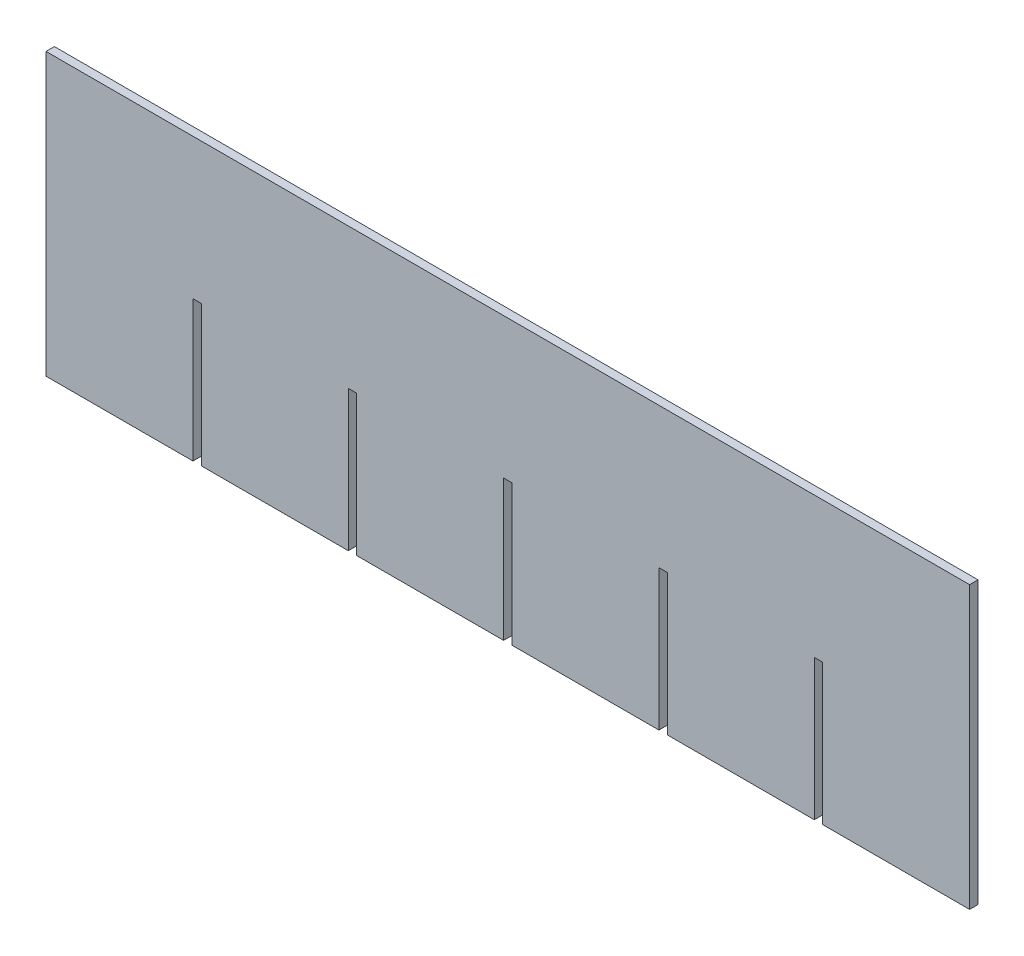
ISO-10303-21;
HEADER;
FILE_DESCRIPTION(('STEP AP214'),'2;1');
FILE_NAME('part.step','',(''),(''),'','','');
FILE_SCHEMA(('AUTOMOTIVE_DESIGN { 1 0 10303 214 1 1 1 1 }'));
ENDSEC;
DATA;
#1=APPLICATION_CONTEXT('core data for automotive mechanical design processes');
#2=APPLICATION_PROTOCOL_DEFINITION('international standard','automotive_design',2000,#1);
#3=PRODUCT_CONTEXT('',#1,'mechanical');
#4=PRODUCT('Part','Part','',(#3));
#5=PRODUCT_RELATED_PRODUCT_CATEGORY('part','',(#4));
#6=PRODUCT_DEFINITION_FORMATION('','',#4);
#7=PRODUCT_DEFINITION_CONTEXT('part definition',#1,'design');
#8=PRODUCT_DEFINITION('design','',#6,#7);
#9=PRODUCT_DEFINITION_SHAPE('','',#8);
#10=(LENGTH_UNIT() NAMED_UNIT(*) SI_UNIT(.MILLI.,.METRE.));
#11=(NAMED_UNIT(*) PLANE_ANGLE_UNIT() SI_UNIT($,.RADIAN.));
#12=(NAMED_UNIT(*) SI_UNIT($,.STERADIAN.) SOLID_ANGLE_UNIT());
#13=UNCERTAINTY_MEASURE_WITH_UNIT(LENGTH_MEASURE(1.E-05),#10,'distance_accuracy_value','');
#14=(GEOMETRIC_REPRESENTATION_CONTEXT(3) GLOBAL_UNCERTAINTY_ASSIGNED_CONTEXT((#13)) GLOBAL_UNIT_ASSIGNED_CONTEXT((#10,
#11,#12)) REPRESENTATION_CONTEXT('',''));
#15=CARTESIAN_POINT('',(0.,0.,0.));
#16=DIRECTION('',(0.,0.,1.));
#17=DIRECTION('',(1.,0.,0.));
#18=AXIS2_PLACEMENT_3D('',#15,#16,#17);
#19=CARTESIAN_POINT('',(110.,-33.5,2.));
#20=DIRECTION('',(0.,1.,0.));
#21=DIRECTION('',(-1.,0.,0.));
#22=AXIS2_PLACEMENT_3D('',#19,#20,#21);
#23=PLANE('',#22);
#24=DIRECTION('',(0.,0.,1.));
#25=VECTOR('',#24,1.);
#26=CARTESIAN_POINT('',(-0.999999999999925,-33.5,0.));
#27=LINE('',#26,#25);
#28=CARTESIAN_POINT('',(-0.999999999999925,-33.5,0.));
#29=VERTEX_POINT('',#28);
#30=CARTESIAN_POINT('',(-0.999999999999925,-33.5,2.));
#31=VERTEX_POINT('',#30);
#32=EDGE_CURVE('E241',#29,#31,#27,.T.);
#33=ORIENTED_EDGE('',*,*,#32,.T.);
#34=DIRECTION('',(1.,0.,0.));
#35=VECTOR('',#34,1.);
#36=CARTESIAN_POINT('',(110.,-33.5,2.));
#37=LINE('',#36,#35);
#38=CARTESIAN_POINT('',(-36.,-33.5,2.));
#39=VERTEX_POINT('',#38);
#40=EDGE_CURVE('E339',#39,#31,#37,.T.);
#41=ORIENTED_EDGE('',*,*,#40,.F.);
#42=DIRECTION('',(0.,0.,1.));
#43=VECTOR('',#42,1.);
#44=CARTESIAN_POINT('',(-36.,-33.5,0.));
#45=LINE('',#44,#43);
#46=CARTESIAN_POINT('',(-36.,-33.5,0.));
#47=VERTEX_POINT('',#46);
#48=EDGE_CURVE('E323',#47,#39,#45,.T.);
#49=ORIENTED_EDGE('',*,*,#48,.F.);
#50=DIRECTION('',(1.,0.,0.));
#51=VECTOR('',#50,1.);
#52=CARTESIAN_POINT('',(110.,-33.5,0.));
#53=LINE('',#52,#51);
#54=EDGE_CURVE('E352',#47,#29,#53,.T.);
#55=ORIENTED_EDGE('',*,*,#54,.T.);
#56=EDGE_LOOP('',(#33,#41,#49,#55));
#57=FACE_BOUND('',#56,.T.);
#58=ADVANCED_FACE('F35',(#57),#23,.F.);
#59=DIRECTION('',(0.,0.,1.));
#60=VECTOR('',#59,1.);
#61=CARTESIAN_POINT('',(1.00000000000008,-33.5,0.));
#62=LINE('',#61,#60);
#63=CARTESIAN_POINT('',(1.00000000000008,-33.5,0.));
#64=VERTEX_POINT('',#63);
#65=CARTESIAN_POINT('',(1.00000000000008,-33.5,2.));
#66=VERTEX_POINT('',#65);
#67=EDGE_CURVE('E235',#64,#66,#62,.T.);
#68=ORIENTED_EDGE('',*,*,#67,.F.);
#69=CARTESIAN_POINT('',(36.,-33.5,0.));
#70=VERTEX_POINT('',#69);
#71=EDGE_CURVE('E397',#64,#70,#53,.T.);
#72=ORIENTED_EDGE('',*,*,#71,.T.);
#73=DIRECTION('',(0.,0.,1.));
#74=VECTOR('',#73,1.);
#75=CARTESIAN_POINT('',(36.,-33.5,0.));
#76=LINE('',#75,#74);
#77=CARTESIAN_POINT('',(36.,-33.5,2.));
#78=VERTEX_POINT('',#77);
#79=EDGE_CURVE('E396',#70,#78,#76,.T.);
#80=ORIENTED_EDGE('',*,*,#79,.T.);
#81=EDGE_CURVE('E384',#66,#78,#37,.T.);
#82=ORIENTED_EDGE('',*,*,#81,.F.);
#83=EDGE_LOOP('',(#68,#72,#80,#82));
#84=FACE_BOUND('',#83,.T.);
#85=ADVANCED_FACE('F393',(#84),#23,.F.);
#86=CARTESIAN_POINT('',(38.,-33.5,2.));
#87=VERTEX_POINT('',#86);
#88=CARTESIAN_POINT('',(73.0000000000001,-33.5,2.));
#89=VERTEX_POINT('',#88);
#90=EDGE_CURVE('E383',#87,#89,#37,.T.);
#91=ORIENTED_EDGE('',*,*,#90,.F.);
#92=DIRECTION('',(0.,0.,1.));
#93=VECTOR('',#92,1.);
#94=CARTESIAN_POINT('',(38.,-33.5,0.));
#95=LINE('',#94,#93);
#96=CARTESIAN_POINT('',(38.,-33.5,0.));
#97=VERTEX_POINT('',#96);
#98=EDGE_CURVE('E206',#97,#87,#95,.T.);
#99=ORIENTED_EDGE('',*,*,#98,.F.);
#100=CARTESIAN_POINT('',(73.0000000000001,-33.5,0.));
#101=VERTEX_POINT('',#100);
#102=EDGE_CURVE('E407',#97,#101,#53,.T.);
#103=ORIENTED_EDGE('',*,*,#102,.T.);
#104=DIRECTION('',(0.,0.,1.));
#105=VECTOR('',#104,1.);
#106=CARTESIAN_POINT('',(73.0000000000001,-33.5,0.));
#107=LINE('',#106,#105);
#108=EDGE_CURVE('E221',#101,#89,#107,.T.);
#109=ORIENTED_EDGE('',*,*,#108,.T.);
#110=EDGE_LOOP('',(#91,#99,#103,#109));
#111=FACE_BOUND('',#110,.T.);
#112=ADVANCED_FACE('F409',(#111),#23,.F.);
#113=DIRECTION('',(0.,0.,1.));
#114=VECTOR('',#113,1.);
#115=CARTESIAN_POINT('',(75.0000000000001,-33.5,0.));
#116=LINE('',#115,#114);
#117=CARTESIAN_POINT('',(75.0000000000001,-33.5,0.));
#118=VERTEX_POINT('',#117);
#119=CARTESIAN_POINT('',(75.0000000000001,-33.5,2.));
#120=VERTEX_POINT('',#119);
#121=EDGE_CURVE('E284',#118,#120,#116,.T.);
#122=ORIENTED_EDGE('',*,*,#121,.F.);
#123=CARTESIAN_POINT('',(110.,-33.5,0.));
#124=VERTEX_POINT('',#123);
#125=EDGE_CURVE('E346',#118,#124,#53,.T.);
#126=ORIENTED_EDGE('',*,*,#125,.T.);
#127=DIRECTION('',(0.,0.,-1.));
#128=VECTOR('',#127,1.);
#129=CARTESIAN_POINT('',(110.,-33.5,2.));
#130=LINE('',#129,#128);
#131=CARTESIAN_POINT('',(110.,-33.5,2.));
#132=VERTEX_POINT('',#131);
#133=EDGE_CURVE('E43',#132,#124,#130,.T.);
#134=ORIENTED_EDGE('',*,*,#133,.F.);
#135=EDGE_CURVE('E332',#120,#132,#37,.T.);
#136=ORIENTED_EDGE('',*,*,#135,.F.);
#137=EDGE_LOOP('',(#122,#126,#134,#136));
#138=FACE_BOUND('',#137,.T.);
#139=ADVANCED_FACE('F418',(#138),#23,.F.);
#140=DIRECTION('',(0.,0.,1.));
#141=VECTOR('',#140,1.);
#142=CARTESIAN_POINT('',(-73.,-33.5,0.));
#143=LINE('',#142,#141);
#144=CARTESIAN_POINT('',(-73.,-33.5,0.));
#145=VERTEX_POINT('',#144);
#146=CARTESIAN_POINT('',(-73.,-33.5,2.));
#147=VERTEX_POINT('',#146);
#148=EDGE_CURVE('E265',#145,#147,#143,.T.);
#149=ORIENTED_EDGE('',*,*,#148,.F.);
#150=CARTESIAN_POINT('',(-38.,-33.5,0.));
#151=VERTEX_POINT('',#150);
#152=EDGE_CURVE('E351',#145,#151,#53,.T.);
#153=ORIENTED_EDGE('',*,*,#152,.T.);
#154=DIRECTION('',(0.,0.,1.));
#155=VECTOR('',#154,1.);
#156=CARTESIAN_POINT('',(-38.,-33.5,0.));
#157=LINE('',#156,#155);
#158=CARTESIAN_POINT('',(-38.,-33.5,2.));
#159=VERTEX_POINT('',#158);
#160=EDGE_CURVE('E325',#151,#159,#157,.T.);
#161=ORIENTED_EDGE('',*,*,#160,.T.);
#162=EDGE_CURVE('E338',#147,#159,#37,.T.);
#163=ORIENTED_EDGE('',*,*,#162,.F.);
#164=EDGE_LOOP('',(#149,#153,#161,#163));
#165=FACE_BOUND('',#164,.T.);
#166=ADVANCED_FACE('F450',(#165),#23,.F.);
#167=DIRECTION('',(0.,0.,1.));
#168=VECTOR('',#167,1.);
#169=CARTESIAN_POINT('',(-75.,-33.5,0.));
#170=LINE('',#169,#168);
#171=CARTESIAN_POINT('',(-75.,-33.5,0.));
#172=VERTEX_POINT('',#171);
#173=CARTESIAN_POINT('',(-75.,-33.5,2.));
#174=VERTEX_POINT('',#173);
#175=EDGE_CURVE('E262',#172,#174,#170,.T.);
#176=ORIENTED_EDGE('',*,*,#175,.T.);
#177=CARTESIAN_POINT('',(-110.,-33.5,2.));
#178=VERTEX_POINT('',#177);
#179=EDGE_CURVE('E334',#178,#174,#37,.T.);
#180=ORIENTED_EDGE('',*,*,#179,.F.);
#181=DIRECTION('',(0.,0.,-1.));
#182=VECTOR('',#181,1.);
#183=CARTESIAN_POINT('',(-110.,-33.5,2.));
#184=LINE('',#183,#182);
#185=CARTESIAN_POINT('',(-110.,-33.5,0.));
#186=VERTEX_POINT('',#185);
#187=EDGE_CURVE('E11',#178,#186,#184,.T.);
#188=ORIENTED_EDGE('',*,*,#187,.T.);
#189=EDGE_CURVE('E347',#186,#172,#53,.T.);
#190=ORIENTED_EDGE('',*,*,#189,.T.);
#191=EDGE_LOOP('',(#176,#180,#188,#190));
#192=FACE_BOUND('',#191,.T.);
#193=ADVANCED_FACE('F444',(#192),#23,.F.);
#194=CARTESIAN_POINT('',(0.,0.,2.));
#195=DIRECTION('',(0.,0.,1.));
#196=DIRECTION('',(1.,0.,0.));
#197=AXIS2_PLACEMENT_3D('',#194,#195,#196);
#198=PLANE('',#197);
#199=ORIENTED_EDGE('',*,*,#40,.T.);
#200=DIRECTION('',(0.,1.,0.));
#201=VECTOR('',#200,1.);
#202=CARTESIAN_POINT('',(-0.999999999999925,-33.5,2.));
#203=LINE('',#202,#201);
#204=CARTESIAN_POINT('',(-0.999999999999931,0.,2.));
#205=VERTEX_POINT('',#204);
#206=EDGE_CURVE('E244',#31,#205,#203,.T.);
#207=ORIENTED_EDGE('',*,*,#206,.T.);
#208=DIRECTION('',(1.,0.,0.));
#209=VECTOR('',#208,1.);
#210=CARTESIAN_POINT('',(-0.999999999999931,0.,2.));
#211=LINE('',#210,#209);
#212=CARTESIAN_POINT('',(1.00000000000007,0.,2.));
#213=VERTEX_POINT('',#212);
#214=EDGE_CURVE('E247',#205,#213,#211,.T.);
#215=ORIENTED_EDGE('',*,*,#214,.T.);
#216=DIRECTION('',(0.,-1.,0.));
#217=VECTOR('',#216,1.);
#218=CARTESIAN_POINT('',(1.00000000000007,0.,2.));
#219=LINE('',#218,#217);
#220=EDGE_CURVE('E207',#213,#66,#219,.T.);
#221=ORIENTED_EDGE('',*,*,#220,.T.);
#222=ORIENTED_EDGE('',*,*,#81,.T.);
#223=DIRECTION('',(0.,-1.,0.));
#224=VECTOR('',#223,1.);
#225=CARTESIAN_POINT('',(36.,0.,2.));
#226=LINE('',#225,#224);
#227=CARTESIAN_POINT('',(36.,0.,2.));
#228=VERTEX_POINT('',#227);
#229=EDGE_CURVE('E216',#228,#78,#226,.T.);
#230=ORIENTED_EDGE('',*,*,#229,.F.);
#231=DIRECTION('',(-1.,0.,0.));
#232=VECTOR('',#231,1.);
#233=CARTESIAN_POINT('',(38.,0.,2.));
#234=LINE('',#233,#232);
#235=CARTESIAN_POINT('',(38.,0.,2.));
#236=VERTEX_POINT('',#235);
#237=EDGE_CURVE('E200',#236,#228,#234,.T.);
#238=ORIENTED_EDGE('',*,*,#237,.F.);
#239=DIRECTION('',(0.,1.,0.));
#240=VECTOR('',#239,1.);
#241=CARTESIAN_POINT('',(38.,-33.5,2.));
#242=LINE('',#241,#240);
#243=EDGE_CURVE('E210',#87,#236,#242,.T.);
#244=ORIENTED_EDGE('',*,*,#243,.F.);
#245=ORIENTED_EDGE('',*,*,#90,.T.);
#246=DIRECTION('',(0.,1.,0.));
#247=VECTOR('',#246,1.);
#248=CARTESIAN_POINT('',(73.0000000000001,-33.5,2.));
#249=LINE('',#248,#247);
#250=CARTESIAN_POINT('',(73.0000000000001,0.,2.));
#251=VERTEX_POINT('',#250);
#252=EDGE_CURVE('E289',#89,#251,#249,.T.);
#253=ORIENTED_EDGE('',*,*,#252,.T.);
#254=DIRECTION('',(1.,0.,0.));
#255=VECTOR('',#254,1.);
#256=CARTESIAN_POINT('',(73.0000000000001,0.,2.));
#257=LINE('',#256,#255);
#258=CARTESIAN_POINT('',(75.0000000000001,0.,2.));
#259=VERTEX_POINT('',#258);
#260=EDGE_CURVE('E292',#251,#259,#257,.T.);
#261=ORIENTED_EDGE('',*,*,#260,.T.);
#262=DIRECTION('',(0.,-1.,0.));
#263=VECTOR('',#262,1.);
#264=CARTESIAN_POINT('',(75.0000000000001,0.,2.));
#265=LINE('',#264,#263);
#266=EDGE_CURVE('E267',#259,#120,#265,.T.);
#267=ORIENTED_EDGE('',*,*,#266,.T.);
#268=ORIENTED_EDGE('',*,*,#135,.T.);
#269=DIRECTION('',(0.,1.,0.));
#270=VECTOR('',#269,1.);
#271=CARTESIAN_POINT('',(110.,-33.5,2.));
#272=LINE('',#271,#270);
#273=CARTESIAN_POINT('',(110.,33.5,2.));
#274=VERTEX_POINT('',#273);
#275=EDGE_CURVE('E337',#132,#274,#272,.T.);
#276=ORIENTED_EDGE('',*,*,#275,.T.);
#277=DIRECTION('',(-1.,0.,0.));
#278=VECTOR('',#277,1.);
#279=CARTESIAN_POINT('',(110.,33.5,2.));
#280=LINE('',#279,#278);
#281=CARTESIAN_POINT('',(-110.,33.5,2.));
#282=VERTEX_POINT('',#281);
#283=EDGE_CURVE('E341',#274,#282,#280,.T.);
#284=ORIENTED_EDGE('',*,*,#283,.T.);
#285=DIRECTION('',(0.,-1.,0.));
#286=VECTOR('',#285,1.);
#287=CARTESIAN_POINT('',(-110.,-33.5,2.));
#288=LINE('',#287,#286);
#289=EDGE_CURVE('E329',#282,#178,#288,.T.);
#290=ORIENTED_EDGE('',*,*,#289,.T.);
#291=ORIENTED_EDGE('',*,*,#179,.T.);
#292=DIRECTION('',(0.,1.,0.));
#293=VECTOR('',#292,1.);
#294=CARTESIAN_POINT('',(-75.,0.,2.));
#295=LINE('',#294,#293);
#296=CARTESIAN_POINT('',(-75.,0.,2.));
#297=VERTEX_POINT('',#296);
#298=EDGE_CURVE('E268',#174,#297,#295,.T.);
#299=ORIENTED_EDGE('',*,*,#298,.T.);
#300=DIRECTION('',(1.,0.,0.));
#301=VECTOR('',#300,1.);
#302=CARTESIAN_POINT('',(0.,0.,2.));
#303=LINE('',#302,#301);
#304=CARTESIAN_POINT('',(-73.,0.,2.));
#305=VERTEX_POINT('',#304);
#306=EDGE_CURVE('E271',#297,#305,#303,.T.);
#307=ORIENTED_EDGE('',*,*,#306,.T.);
#308=DIRECTION('',(0.,-1.,0.));
#309=VECTOR('',#308,1.);
#310=CARTESIAN_POINT('',(-73.,0.,2.));
#311=LINE('',#310,#309);
#312=EDGE_CURVE('E275',#305,#147,#311,.T.);
#313=ORIENTED_EDGE('',*,*,#312,.T.);
#314=ORIENTED_EDGE('',*,*,#162,.T.);
#315=DIRECTION('',(0.,-1.,0.));
#316=VECTOR('',#315,1.);
#317=CARTESIAN_POINT('',(-38.,0.,2.));
#318=LINE('',#317,#316);
#319=CARTESIAN_POINT('',(-38.,0.,2.));
#320=VERTEX_POINT('',#319);
#321=EDGE_CURVE('E315',#320,#159,#318,.T.);
#322=ORIENTED_EDGE('',*,*,#321,.F.);
#323=DIRECTION('',(-1.,0.,0.));
#324=VECTOR('',#323,1.);
#325=CARTESIAN_POINT('',(0.,0.,2.));
#326=LINE('',#325,#324);
#327=CARTESIAN_POINT('',(-36.,0.,2.));
#328=VERTEX_POINT('',#327);
#329=EDGE_CURVE('E278',#328,#320,#326,.T.);
#330=ORIENTED_EDGE('',*,*,#329,.F.);
#331=DIRECTION('',(0.,1.,0.));
#332=VECTOR('',#331,1.);
#333=CARTESIAN_POINT('',(-36.,0.,2.));
#334=LINE('',#333,#332);
#335=EDGE_CURVE('E306',#39,#328,#334,.T.);
#336=ORIENTED_EDGE('',*,*,#335,.F.);
#337=EDGE_LOOP('',(#199,#207,#215,#221,#222,#230,#238,#244,#245,#253,#261,#267,#268,#276,#284,
#290,#291,#299,#307,#313,#314,#322,#330,#336));
#338=FACE_BOUND('',#337,.T.);
#339=ADVANCED_FACE('F219',(#338),#198,.T.);
#340=CARTESIAN_POINT('',(0.,0.,0.));
#341=DIRECTION('',(0.,0.,1.));
#342=DIRECTION('',(1.,0.,0.));
#343=AXIS2_PLACEMENT_3D('',#340,#341,#342);
#344=PLANE('',#343);
#345=DIRECTION('',(0.,1.,0.));
#346=VECTOR('',#345,1.);
#347=CARTESIAN_POINT('',(-0.999999999999925,-33.5,0.));
#348=LINE('',#347,#346);
#349=CARTESIAN_POINT('',(-0.999999999999931,0.,0.));
#350=VERTEX_POINT('',#349);
#351=EDGE_CURVE('E237',#29,#350,#348,.T.);
#352=ORIENTED_EDGE('',*,*,#351,.F.);
#353=ORIENTED_EDGE('',*,*,#54,.F.);
#354=DIRECTION('',(0.,1.,0.));
#355=VECTOR('',#354,1.);
#356=CARTESIAN_POINT('',(-36.,0.,0.));
#357=LINE('',#356,#355);
#358=CARTESIAN_POINT('',(-36.,0.,0.));
#359=VERTEX_POINT('',#358);
#360=EDGE_CURVE('E309',#47,#359,#357,.T.);
#361=ORIENTED_EDGE('',*,*,#360,.T.);
#362=DIRECTION('',(-1.,0.,0.));
#363=VECTOR('',#362,1.);
#364=CARTESIAN_POINT('',(0.,0.,0.));
#365=LINE('',#364,#363);
#366=CARTESIAN_POINT('',(-38.,0.,0.));
#367=VERTEX_POINT('',#366);
#368=EDGE_CURVE('E302',#359,#367,#365,.T.);
#369=ORIENTED_EDGE('',*,*,#368,.T.);
#370=DIRECTION('',(0.,-1.,0.));
#371=VECTOR('',#370,1.);
#372=CARTESIAN_POINT('',(-38.,0.,0.));
#373=LINE('',#372,#371);
#374=EDGE_CURVE('E305',#367,#151,#373,.T.);
#375=ORIENTED_EDGE('',*,*,#374,.T.);
#376=ORIENTED_EDGE('',*,*,#152,.F.);
#377=DIRECTION('',(0.,-1.,0.));
#378=VECTOR('',#377,1.);
#379=CARTESIAN_POINT('',(-73.,0.,0.));
#380=LINE('',#379,#378);
#381=CARTESIAN_POINT('',(-73.,0.,0.));
#382=VERTEX_POINT('',#381);
#383=EDGE_CURVE('E272',#382,#145,#380,.T.);
#384=ORIENTED_EDGE('',*,*,#383,.F.);
#385=DIRECTION('',(1.,0.,0.));
#386=VECTOR('',#385,1.);
#387=CARTESIAN_POINT('',(0.,0.,0.));
#388=LINE('',#387,#386);
#389=CARTESIAN_POINT('',(-75.,0.,0.));
#390=VERTEX_POINT('',#389);
#391=EDGE_CURVE('E281',#390,#382,#388,.T.);
#392=ORIENTED_EDGE('',*,*,#391,.F.);
#393=DIRECTION('',(0.,1.,0.));
#394=VECTOR('',#393,1.);
#395=CARTESIAN_POINT('',(-75.,0.,0.));
#396=LINE('',#395,#394);
#397=EDGE_CURVE('E259',#172,#390,#396,.T.);
#398=ORIENTED_EDGE('',*,*,#397,.F.);
#399=ORIENTED_EDGE('',*,*,#189,.F.);
#400=DIRECTION('',(0.,-1.,0.));
#401=VECTOR('',#400,1.);
#402=CARTESIAN_POINT('',(-110.,-33.5,0.));
#403=LINE('',#402,#401);
#404=CARTESIAN_POINT('',(-110.,33.5,0.));
#405=VERTEX_POINT('',#404);
#406=EDGE_CURVE('E322',#405,#186,#403,.T.);
#407=ORIENTED_EDGE('',*,*,#406,.F.);
#408=DIRECTION('',(-1.,0.,0.));
#409=VECTOR('',#408,1.);
#410=CARTESIAN_POINT('',(110.,33.5,0.));
#411=LINE('',#410,#409);
#412=CARTESIAN_POINT('',(110.,33.5,0.));
#413=VERTEX_POINT('',#412);
#414=EDGE_CURVE('E333',#413,#405,#411,.T.);
#415=ORIENTED_EDGE('',*,*,#414,.F.);
#416=DIRECTION('',(0.,1.,0.));
#417=VECTOR('',#416,1.);
#418=CARTESIAN_POINT('',(110.,-33.5,0.));
#419=LINE('',#418,#417);
#420=EDGE_CURVE('E350',#124,#413,#419,.T.);
#421=ORIENTED_EDGE('',*,*,#420,.F.);
#422=ORIENTED_EDGE('',*,*,#125,.F.);
#423=DIRECTION('',(0.,-1.,0.));
#424=VECTOR('',#423,1.);
#425=CARTESIAN_POINT('',(75.0000000000001,0.,0.));
#426=LINE('',#425,#424);
#427=CARTESIAN_POINT('',(75.0000000000001,0.,0.));
#428=VERTEX_POINT('',#427);
#429=EDGE_CURVE('E293',#428,#118,#426,.T.);
#430=ORIENTED_EDGE('',*,*,#429,.F.);
#431=DIRECTION('',(1.,0.,0.));
#432=VECTOR('',#431,1.);
#433=CARTESIAN_POINT('',(73.0000000000001,0.,0.));
#434=LINE('',#433,#432);
#435=CARTESIAN_POINT('',(73.0000000000001,0.,0.));
#436=VERTEX_POINT('',#435);
#437=EDGE_CURVE('E299',#436,#428,#434,.T.);
#438=ORIENTED_EDGE('',*,*,#437,.F.);
#439=DIRECTION('',(0.,1.,0.));
#440=VECTOR('',#439,1.);
#441=CARTESIAN_POINT('',(73.0000000000001,-33.5,0.));
#442=LINE('',#441,#440);
#443=EDGE_CURVE('E286',#101,#436,#442,.T.);
#444=ORIENTED_EDGE('',*,*,#443,.F.);
#445=ORIENTED_EDGE('',*,*,#102,.F.);
#446=DIRECTION('',(0.,1.,0.));
#447=VECTOR('',#446,1.);
#448=CARTESIAN_POINT('',(38.,-33.5,0.));
#449=LINE('',#448,#447);
#450=CARTESIAN_POINT('',(38.,0.,0.));
#451=VERTEX_POINT('',#450);
#452=EDGE_CURVE('E228',#97,#451,#449,.T.);
#453=ORIENTED_EDGE('',*,*,#452,.T.);
#454=DIRECTION('',(-1.,0.,0.));
#455=VECTOR('',#454,1.);
#456=CARTESIAN_POINT('',(38.,0.,0.));
#457=LINE('',#456,#455);
#458=CARTESIAN_POINT('',(36.,0.,0.));
#459=VERTEX_POINT('',#458);
#460=EDGE_CURVE('E203',#451,#459,#457,.T.);
#461=ORIENTED_EDGE('',*,*,#460,.T.);
#462=DIRECTION('',(0.,-1.,0.));
#463=VECTOR('',#462,1.);
#464=CARTESIAN_POINT('',(36.,0.,0.));
#465=LINE('',#464,#463);
#466=EDGE_CURVE('E230',#459,#70,#465,.T.);
#467=ORIENTED_EDGE('',*,*,#466,.T.);
#468=ORIENTED_EDGE('',*,*,#71,.F.);
#469=DIRECTION('',(0.,-1.,0.));
#470=VECTOR('',#469,1.);
#471=CARTESIAN_POINT('',(1.00000000000007,0.,0.));
#472=LINE('',#471,#470);
#473=CARTESIAN_POINT('',(1.00000000000007,0.,0.));
#474=VERTEX_POINT('',#473);
#475=EDGE_CURVE('E248',#474,#64,#472,.T.);
#476=ORIENTED_EDGE('',*,*,#475,.F.);
#477=DIRECTION('',(1.,0.,0.));
#478=VECTOR('',#477,1.);
#479=CARTESIAN_POINT('',(-0.999999999999931,0.,0.));
#480=LINE('',#479,#478);
#481=EDGE_CURVE('E254',#350,#474,#480,.T.);
#482=ORIENTED_EDGE('',*,*,#481,.F.);
#483=EDGE_LOOP('',(#352,#353,#361,#369,#375,#376,#384,#392,#398,#399,#407,#415,#421,#422,#430,
#438,#444,#445,#453,#461,#467,#468,#476,#482));
#484=FACE_BOUND('',#483,.T.);
#485=ADVANCED_FACE('F372',(#484),#344,.F.);
#486=CARTESIAN_POINT('',(-110.,-33.5,2.));
#487=DIRECTION('',(1.,0.,0.));
#488=DIRECTION('',(0.,0.,-1.));
#489=AXIS2_PLACEMENT_3D('',#486,#487,#488);
#490=PLANE('',#489);
#491=ORIENTED_EDGE('',*,*,#406,.T.);
#492=ORIENTED_EDGE('',*,*,#187,.F.);
#493=ORIENTED_EDGE('',*,*,#289,.F.);
#494=DIRECTION('',(0.,0.,-1.));
#495=VECTOR('',#494,1.);
#496=CARTESIAN_POINT('',(-110.,33.5,2.));
#497=LINE('',#496,#495);
#498=EDGE_CURVE('E343',#282,#405,#497,.T.);
#499=ORIENTED_EDGE('',*,*,#498,.T.);
#500=EDGE_LOOP('',(#491,#492,#493,#499));
#501=FACE_BOUND('',#500,.T.);
#502=ADVANCED_FACE('F37',(#501),#490,.F.);
#503=CARTESIAN_POINT('',(110.,-33.5,2.));
#504=DIRECTION('',(-1.,0.,0.));
#505=DIRECTION('',(0.,0.,1.));
#506=AXIS2_PLACEMENT_3D('',#503,#504,#505);
#507=PLANE('',#506);
#508=ORIENTED_EDGE('',*,*,#420,.T.);
#509=DIRECTION('',(0.,0.,-1.));
#510=VECTOR('',#509,1.);
#511=CARTESIAN_POINT('',(110.,33.5,2.));
#512=LINE('',#511,#510);
#513=EDGE_CURVE('E357',#274,#413,#512,.T.);
#514=ORIENTED_EDGE('',*,*,#513,.F.);
#515=ORIENTED_EDGE('',*,*,#275,.F.);
#516=ORIENTED_EDGE('',*,*,#133,.T.);
#517=EDGE_LOOP('',(#508,#514,#515,#516));
#518=FACE_BOUND('',#517,.T.);
#519=ADVANCED_FACE('F364',(#518),#507,.F.);
#520=CARTESIAN_POINT('',(110.,33.5,2.));
#521=DIRECTION('',(0.,-1.,0.));
#522=DIRECTION('',(1.,0.,0.));
#523=AXIS2_PLACEMENT_3D('',#520,#521,#522);
#524=PLANE('',#523);
#525=ORIENTED_EDGE('',*,*,#414,.T.);
#526=ORIENTED_EDGE('',*,*,#498,.F.);
#527=ORIENTED_EDGE('',*,*,#283,.F.);
#528=ORIENTED_EDGE('',*,*,#513,.T.);
#529=EDGE_LOOP('',(#525,#526,#527,#528));
#530=FACE_BOUND('',#529,.T.);
#531=ADVANCED_FACE('F377',(#530),#524,.F.);
#532=CARTESIAN_POINT('',(0.,0.,0.));
#533=DIRECTION('',(0.,1.,0.));
#534=DIRECTION('',(0.,0.,1.));
#535=AXIS2_PLACEMENT_3D('',#532,#533,#534);
#536=PLANE('',#535);
#537=ORIENTED_EDGE('',*,*,#329,.T.);
#538=DIRECTION('',(0.,0.,1.));
#539=VECTOR('',#538,1.);
#540=CARTESIAN_POINT('',(-38.,0.,0.));
#541=LINE('',#540,#539);
#542=EDGE_CURVE('E312',#367,#320,#541,.T.);
#543=ORIENTED_EDGE('',*,*,#542,.F.);
#544=ORIENTED_EDGE('',*,*,#368,.F.);
#545=DIRECTION('',(0.,0.,1.));
#546=VECTOR('',#545,1.);
#547=CARTESIAN_POINT('',(-36.,0.,0.));
#548=LINE('',#547,#546);
#549=EDGE_CURVE('E320',#359,#328,#548,.T.);
#550=ORIENTED_EDGE('',*,*,#549,.T.);
#551=EDGE_LOOP('',(#537,#543,#544,#550));
#552=FACE_BOUND('',#551,.T.);
#553=ADVANCED_FACE('F474',(#552),#536,.F.);
#554=CARTESIAN_POINT('',(-36.,0.,0.));
#555=DIRECTION('',(1.,0.,0.));
#556=DIRECTION('',(0.,0.,-1.));
#557=AXIS2_PLACEMENT_3D('',#554,#555,#556);
#558=PLANE('',#557);
#559=ORIENTED_EDGE('',*,*,#335,.T.);
#560=ORIENTED_EDGE('',*,*,#549,.F.);
#561=ORIENTED_EDGE('',*,*,#360,.F.);
#562=ORIENTED_EDGE('',*,*,#48,.T.);
#563=EDGE_LOOP('',(#559,#560,#561,#562));
#564=FACE_BOUND('',#563,.T.);
#565=ADVANCED_FACE('F477',(#564),#558,.F.);
#566=CARTESIAN_POINT('',(-38.,0.,0.));
#567=DIRECTION('',(-1.,0.,0.));
#568=DIRECTION('',(0.,0.,1.));
#569=AXIS2_PLACEMENT_3D('',#566,#567,#568);
#570=PLANE('',#569);
#571=ORIENTED_EDGE('',*,*,#321,.T.);
#572=ORIENTED_EDGE('',*,*,#160,.F.);
#573=ORIENTED_EDGE('',*,*,#374,.F.);
#574=ORIENTED_EDGE('',*,*,#542,.T.);
#575=EDGE_LOOP('',(#571,#572,#573,#574));
#576=FACE_BOUND('',#575,.T.);
#577=ADVANCED_FACE('F471',(#576),#570,.F.);
#578=CARTESIAN_POINT('',(-73.,0.,0.));
#579=DIRECTION('',(-1.,0.,0.));
#580=DIRECTION('',(0.,0.,1.));
#581=AXIS2_PLACEMENT_3D('',#578,#579,#580);
#582=PLANE('',#581);
#583=ORIENTED_EDGE('',*,*,#312,.F.);
#584=DIRECTION('',(0.,0.,1.));
#585=VECTOR('',#584,1.);
#586=CARTESIAN_POINT('',(-73.,0.,0.));
#587=LINE('',#586,#585);
#588=EDGE_CURVE('E257',#382,#305,#587,.T.);
#589=ORIENTED_EDGE('',*,*,#588,.F.);
#590=ORIENTED_EDGE('',*,*,#383,.T.);
#591=ORIENTED_EDGE('',*,*,#148,.T.);
#592=EDGE_LOOP('',(#583,#589,#590,#591));
#593=FACE_BOUND('',#592,.T.);
#594=ADVANCED_FACE('F468',(#593),#582,.T.);
#595=CARTESIAN_POINT('',(-75.,0.,0.));
#596=DIRECTION('',(1.,0.,0.));
#597=DIRECTION('',(0.,0.,-1.));
#598=AXIS2_PLACEMENT_3D('',#595,#596,#597);
#599=PLANE('',#598);
#600=ORIENTED_EDGE('',*,*,#298,.F.);
#601=ORIENTED_EDGE('',*,*,#175,.F.);
#602=ORIENTED_EDGE('',*,*,#397,.T.);
#603=DIRECTION('',(0.,0.,1.));
#604=VECTOR('',#603,1.);
#605=CARTESIAN_POINT('',(-75.,0.,0.));
#606=LINE('',#605,#604);
#607=EDGE_CURVE('E260',#390,#297,#606,.T.);
#608=ORIENTED_EDGE('',*,*,#607,.T.);
#609=EDGE_LOOP('',(#600,#601,#602,#608));
#610=FACE_BOUND('',#609,.T.);
#611=ADVANCED_FACE('F459',(#610),#599,.T.);
#612=CARTESIAN_POINT('',(0.,0.,0.));
#613=DIRECTION('',(0.,-1.,0.));
#614=DIRECTION('',(0.,0.,-1.));
#615=AXIS2_PLACEMENT_3D('',#612,#613,#614);
#616=PLANE('',#615);
#617=ORIENTED_EDGE('',*,*,#306,.F.);
#618=ORIENTED_EDGE('',*,*,#607,.F.);
#619=ORIENTED_EDGE('',*,*,#391,.T.);
#620=ORIENTED_EDGE('',*,*,#588,.T.);
#621=EDGE_LOOP('',(#617,#618,#619,#620));
#622=FACE_BOUND('',#621,.T.);
#623=ADVANCED_FACE('F465',(#622),#616,.T.);
#624=CARTESIAN_POINT('',(73.0000000000001,-33.5,0.));
#625=DIRECTION('',(1.,0.,0.));
#626=DIRECTION('',(0.,1.,0.));
#627=AXIS2_PLACEMENT_3D('',#624,#625,#626);
#628=PLANE('',#627);
#629=ORIENTED_EDGE('',*,*,#252,.F.);
#630=ORIENTED_EDGE('',*,*,#108,.F.);
#631=ORIENTED_EDGE('',*,*,#443,.T.);
#632=DIRECTION('',(0.,0.,1.));
#633=VECTOR('',#632,1.);
#634=CARTESIAN_POINT('',(73.0000000000001,0.,0.));
#635=LINE('',#634,#633);
#636=EDGE_CURVE('E224',#436,#251,#635,.T.);
#637=ORIENTED_EDGE('',*,*,#636,.T.);
#638=EDGE_LOOP('',(#629,#630,#631,#637));
#639=FACE_BOUND('',#638,.T.);
#640=ADVANCED_FACE('F412',(#639),#628,.T.);
#641=CARTESIAN_POINT('',(73.0000000000001,0.,0.));
#642=DIRECTION('',(0.,-1.,0.));
#643=DIRECTION('',(0.,0.,-1.));
#644=AXIS2_PLACEMENT_3D('',#641,#642,#643);
#645=PLANE('',#644);
#646=ORIENTED_EDGE('',*,*,#260,.F.);
#647=ORIENTED_EDGE('',*,*,#636,.F.);
#648=ORIENTED_EDGE('',*,*,#437,.T.);
#649=DIRECTION('',(0.,0.,1.));
#650=VECTOR('',#649,1.);
#651=CARTESIAN_POINT('',(75.0000000000001,0.,0.));
#652=LINE('',#651,#650);
#653=EDGE_CURVE('E58',#428,#259,#652,.T.);
#654=ORIENTED_EDGE('',*,*,#653,.T.);
#655=EDGE_LOOP('',(#646,#647,#648,#654));
#656=FACE_BOUND('',#655,.T.);
#657=ADVANCED_FACE('F416',(#656),#645,.T.);
#658=CARTESIAN_POINT('',(75.0000000000001,0.,0.));
#659=DIRECTION('',(-1.,0.,0.));
#660=DIRECTION('',(0.,-1.,0.));
#661=AXIS2_PLACEMENT_3D('',#658,#659,#660);
#662=PLANE('',#661);
#663=ORIENTED_EDGE('',*,*,#266,.F.);
#664=ORIENTED_EDGE('',*,*,#653,.F.);
#665=ORIENTED_EDGE('',*,*,#429,.T.);
#666=ORIENTED_EDGE('',*,*,#121,.T.);
#667=EDGE_LOOP('',(#663,#664,#665,#666));
#668=FACE_BOUND('',#667,.T.);
#669=ADVANCED_FACE('F417',(#668),#662,.T.);
#670=CARTESIAN_POINT('',(38.,0.,0.));
#671=DIRECTION('',(0.,1.,0.));
#672=DIRECTION('',(0.,0.,1.));
#673=AXIS2_PLACEMENT_3D('',#670,#671,#672);
#674=PLANE('',#673);
#675=ORIENTED_EDGE('',*,*,#237,.T.);
#676=DIRECTION('',(0.,0.,1.));
#677=VECTOR('',#676,1.);
#678=CARTESIAN_POINT('',(36.,0.,0.));
#679=LINE('',#678,#677);
#680=EDGE_CURVE('E231',#459,#228,#679,.T.);
#681=ORIENTED_EDGE('',*,*,#680,.F.);
#682=ORIENTED_EDGE('',*,*,#460,.F.);
#683=DIRECTION('',(0.,0.,1.));
#684=VECTOR('',#683,1.);
#685=CARTESIAN_POINT('',(38.,0.,0.));
#686=LINE('',#685,#684);
#687=EDGE_CURVE('E196',#451,#236,#686,.T.);
#688=ORIENTED_EDGE('',*,*,#687,.T.);
#689=EDGE_LOOP('',(#675,#681,#682,#688));
#690=FACE_BOUND('',#689,.T.);
#691=ADVANCED_FACE('F198',(#690),#674,.F.);
#692=CARTESIAN_POINT('',(38.,-33.5,0.));
#693=DIRECTION('',(1.,0.,0.));
#694=DIRECTION('',(0.,1.,0.));
#695=AXIS2_PLACEMENT_3D('',#692,#693,#694);
#696=PLANE('',#695);
#697=ORIENTED_EDGE('',*,*,#243,.T.);
#698=ORIENTED_EDGE('',*,*,#687,.F.);
#699=ORIENTED_EDGE('',*,*,#452,.F.);
#700=ORIENTED_EDGE('',*,*,#98,.T.);
#701=EDGE_LOOP('',(#697,#698,#699,#700));
#702=FACE_BOUND('',#701,.T.);
#703=ADVANCED_FACE('F211',(#702),#696,.F.);
#704=CARTESIAN_POINT('',(36.,0.,0.));
#705=DIRECTION('',(-1.,0.,0.));
#706=DIRECTION('',(0.,-1.,0.));
#707=AXIS2_PLACEMENT_3D('',#704,#705,#706);
#708=PLANE('',#707);
#709=ORIENTED_EDGE('',*,*,#229,.T.);
#710=ORIENTED_EDGE('',*,*,#79,.F.);
#711=ORIENTED_EDGE('',*,*,#466,.F.);
#712=ORIENTED_EDGE('',*,*,#680,.T.);
#713=EDGE_LOOP('',(#709,#710,#711,#712));
#714=FACE_BOUND('',#713,.T.);
#715=ADVANCED_FACE('F403',(#714),#708,.F.);
#716=CARTESIAN_POINT('',(-0.999999999999925,-33.5,0.));
#717=DIRECTION('',(1.,0.,0.));
#718=DIRECTION('',(0.,1.,0.));
#719=AXIS2_PLACEMENT_3D('',#716,#717,#718);
#720=PLANE('',#719);
#721=ORIENTED_EDGE('',*,*,#206,.F.);
#722=ORIENTED_EDGE('',*,*,#32,.F.);
#723=ORIENTED_EDGE('',*,*,#351,.T.);
#724=DIRECTION('',(0.,0.,1.));
#725=VECTOR('',#724,1.);
#726=CARTESIAN_POINT('',(-0.999999999999931,0.,0.));
#727=LINE('',#726,#725);
#728=EDGE_CURVE('E239',#350,#205,#727,.T.);
#729=ORIENTED_EDGE('',*,*,#728,.T.);
#730=EDGE_LOOP('',(#721,#722,#723,#729));
#731=FACE_BOUND('',#730,.T.);
#732=ADVANCED_FACE('F431',(#731),#720,.T.);
#733=CARTESIAN_POINT('',(-0.999999999999931,0.,0.));
#734=DIRECTION('',(0.,-1.,0.));
#735=DIRECTION('',(0.,0.,-1.));
#736=AXIS2_PLACEMENT_3D('',#733,#734,#735);
#737=PLANE('',#736);
#738=ORIENTED_EDGE('',*,*,#214,.F.);
#739=ORIENTED_EDGE('',*,*,#728,.F.);
#740=ORIENTED_EDGE('',*,*,#481,.T.);
#741=DIRECTION('',(0.,0.,1.));
#742=VECTOR('',#741,1.);
#743=CARTESIAN_POINT('',(1.00000000000007,0.,0.));
#744=LINE('',#743,#742);
#745=EDGE_CURVE('E50',#474,#213,#744,.T.);
#746=ORIENTED_EDGE('',*,*,#745,.T.);
#747=EDGE_LOOP('',(#738,#739,#740,#746));
#748=FACE_BOUND('',#747,.T.);
#749=ADVANCED_FACE('F434',(#748),#737,.T.);
#750=CARTESIAN_POINT('',(1.00000000000007,0.,0.));
#751=DIRECTION('',(-1.,0.,0.));
#752=DIRECTION('',(0.,-1.,0.));
#753=AXIS2_PLACEMENT_3D('',#750,#751,#752);
#754=PLANE('',#753);
#755=ORIENTED_EDGE('',*,*,#220,.F.);
#756=ORIENTED_EDGE('',*,*,#745,.F.);
#757=ORIENTED_EDGE('',*,*,#475,.T.);
#758=ORIENTED_EDGE('',*,*,#67,.T.);
#759=EDGE_LOOP('',(#755,#756,#757,#758));
#760=FACE_BOUND('',#759,.T.);
#761=ADVANCED_FACE('F435',(#760),#754,.T.);
#762=CLOSED_SHELL('',(#58,#85,#112,#139,#166,#193,#339,#485,#502,#519,#531,#553,#565,#577,#594,
#611,#623,#640,#657,#669,#691,#703,#715,#732,#749,#761));
#763=MANIFOLD_SOLID_BREP('B2',#762);
#764=ADVANCED_BREP_SHAPE_REPRESENTATION('',(#18,#763),#14);
#765=SHAPE_DEFINITION_REPRESENTATION(#9,#764);
ENDSEC;
END-ISO-10303-21;
